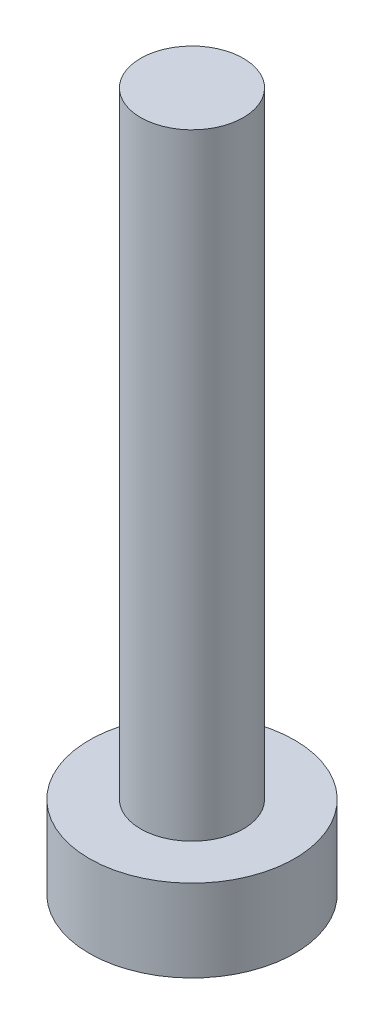
ISO-10303-21;
HEADER;
FILE_DESCRIPTION(('STEP AP214'),'2;1');
FILE_NAME('part.step','',(''),(''),'','','');
FILE_SCHEMA(('AUTOMOTIVE_DESIGN { 1 0 10303 214 1 1 1 1 }'));
ENDSEC;
DATA;
#1=APPLICATION_CONTEXT('core data for automotive mechanical design processes');
#2=APPLICATION_PROTOCOL_DEFINITION('international standard','automotive_design',2000,#1);
#3=PRODUCT_CONTEXT('',#1,'mechanical');
#4=PRODUCT('Part','Part','',(#3));
#5=PRODUCT_RELATED_PRODUCT_CATEGORY('part','',(#4));
#6=PRODUCT_DEFINITION_FORMATION('','',#4);
#7=PRODUCT_DEFINITION_CONTEXT('part definition',#1,'design');
#8=PRODUCT_DEFINITION('design','',#6,#7);
#9=PRODUCT_DEFINITION_SHAPE('','',#8);
#10=(LENGTH_UNIT() NAMED_UNIT(*) SI_UNIT(.MILLI.,.METRE.));
#11=(NAMED_UNIT(*) PLANE_ANGLE_UNIT() SI_UNIT($,.RADIAN.));
#12=(NAMED_UNIT(*) SI_UNIT($,.STERADIAN.) SOLID_ANGLE_UNIT());
#13=UNCERTAINTY_MEASURE_WITH_UNIT(LENGTH_MEASURE(1.E-05),#10,'distance_accuracy_value','');
#14=(GEOMETRIC_REPRESENTATION_CONTEXT(3) GLOBAL_UNCERTAINTY_ASSIGNED_CONTEXT((#13)) GLOBAL_UNIT_ASSIGNED_CONTEXT((#10,
#11,#12)) REPRESENTATION_CONTEXT('',''));
#15=CARTESIAN_POINT('',(0.,0.,0.));
#16=DIRECTION('',(0.,0.,1.));
#17=DIRECTION('',(1.,0.,0.));
#18=AXIS2_PLACEMENT_3D('',#15,#16,#17);
#19=CARTESIAN_POINT('',(0.,1.6,0.));
#20=DIRECTION('',(0.,1.,0.));
#21=DIRECTION('',(0.,0.,1.));
#22=AXIS2_PLACEMENT_3D('',#19,#20,#21);
#23=PLANE('',#22);
#24=CARTESIAN_POINT('',(0.,1.6,0.));
#25=DIRECTION('',(0.,1.,0.));
#26=DIRECTION('',(0.,0.,1.));
#27=AXIS2_PLACEMENT_3D('',#24,#25,#26);
#28=CIRCLE('',#27,2.);
#29=CARTESIAN_POINT('',(0.,1.6,2.));
#30=VERTEX_POINT('',#29);
#31=EDGE_CURVE('E10',#30,#30,#28,.T.);
#32=ORIENTED_EDGE('',*,*,#31,.T.);
#33=EDGE_LOOP('',(#32));
#34=FACE_BOUND('',#33,.T.);
#35=CARTESIAN_POINT('',(0.,1.6,0.));
#36=DIRECTION('',(0.,1.,0.));
#37=DIRECTION('',(0.,0.,1.));
#38=AXIS2_PLACEMENT_3D('',#35,#36,#37);
#39=CIRCLE('',#38,1.);
#40=CARTESIAN_POINT('',(0.,1.6,1.));
#41=VERTEX_POINT('',#40);
#42=EDGE_CURVE('E44',#41,#41,#39,.T.);
#43=ORIENTED_EDGE('',*,*,#42,.F.);
#44=EDGE_LOOP('',(#43));
#45=FACE_BOUND('',#44,.T.);
#46=ADVANCED_FACE('F31',(#34,#45),#23,.T.);
#47=CARTESIAN_POINT('',(0.,1.6,0.));
#48=DIRECTION('',(0.,-1.,0.));
#49=DIRECTION('',(0.,0.,-1.));
#50=AXIS2_PLACEMENT_3D('',#47,#48,#49);
#51=CYLINDRICAL_SURFACE('',#50,2.);
#52=ORIENTED_EDGE('',*,*,#31,.F.);
#53=EDGE_LOOP('',(#52));
#54=FACE_BOUND('',#53,.T.);
#55=CARTESIAN_POINT('',(0.,0.,0.));
#56=DIRECTION('',(0.,1.,0.));
#57=DIRECTION('',(0.,0.,1.));
#58=AXIS2_PLACEMENT_3D('',#55,#56,#57);
#59=CIRCLE('',#58,2.);
#60=CARTESIAN_POINT('',(0.,0.,2.));
#61=VERTEX_POINT('',#60);
#62=EDGE_CURVE('E35',#61,#61,#59,.T.);
#63=ORIENTED_EDGE('',*,*,#62,.T.);
#64=EDGE_LOOP('',(#63));
#65=FACE_BOUND('',#64,.T.);
#66=ADVANCED_FACE('F33',(#54,#65),#51,.T.);
#67=CARTESIAN_POINT('',(0.,0.,0.));
#68=DIRECTION('',(0.,1.,0.));
#69=DIRECTION('',(0.,0.,1.));
#70=AXIS2_PLACEMENT_3D('',#67,#68,#69);
#71=PLANE('',#70);
#72=ORIENTED_EDGE('',*,*,#62,.F.);
#73=EDGE_LOOP('',(#72));
#74=FACE_BOUND('',#73,.T.);
#75=ADVANCED_FACE('F55',(#74),#71,.F.);
#76=CARTESIAN_POINT('',(0.,13.6,0.));
#77=DIRECTION('',(0.,-1.,0.));
#78=DIRECTION('',(0.,0.,-1.));
#79=AXIS2_PLACEMENT_3D('',#76,#77,#78);
#80=CYLINDRICAL_SURFACE('',#79,1.);
#81=CARTESIAN_POINT('',(0.,13.6,0.));
#82=DIRECTION('',(0.,1.,0.));
#83=DIRECTION('',(0.,0.,1.));
#84=AXIS2_PLACEMENT_3D('',#81,#82,#83);
#85=CIRCLE('',#84,1.);
#86=CARTESIAN_POINT('',(0.,13.6,1.));
#87=VERTEX_POINT('',#86);
#88=EDGE_CURVE('E42',#87,#87,#85,.T.);
#89=ORIENTED_EDGE('',*,*,#88,.F.);
#90=EDGE_LOOP('',(#89));
#91=FACE_BOUND('',#90,.T.);
#92=ORIENTED_EDGE('',*,*,#42,.T.);
#93=EDGE_LOOP('',(#92));
#94=FACE_BOUND('',#93,.T.);
#95=ADVANCED_FACE('F52',(#91,#94),#80,.T.);
#96=CARTESIAN_POINT('',(0.,13.6,0.));
#97=DIRECTION('',(0.,1.,0.));
#98=DIRECTION('',(0.,0.,1.));
#99=AXIS2_PLACEMENT_3D('',#96,#97,#98);
#100=PLANE('',#99);
#101=ORIENTED_EDGE('',*,*,#88,.T.);
#102=EDGE_LOOP('',(#101));
#103=FACE_BOUND('',#102,.T.);
#104=ADVANCED_FACE('F50',(#103),#100,.T.);
#105=CLOSED_SHELL('',(#46,#66,#75,#95,#104));
#106=MANIFOLD_SOLID_BREP('B2',#105);
#107=ADVANCED_BREP_SHAPE_REPRESENTATION('',(#18,#106),#14);
#108=SHAPE_DEFINITION_REPRESENTATION(#9,#107);
ENDSEC;
END-ISO-10303-21;
